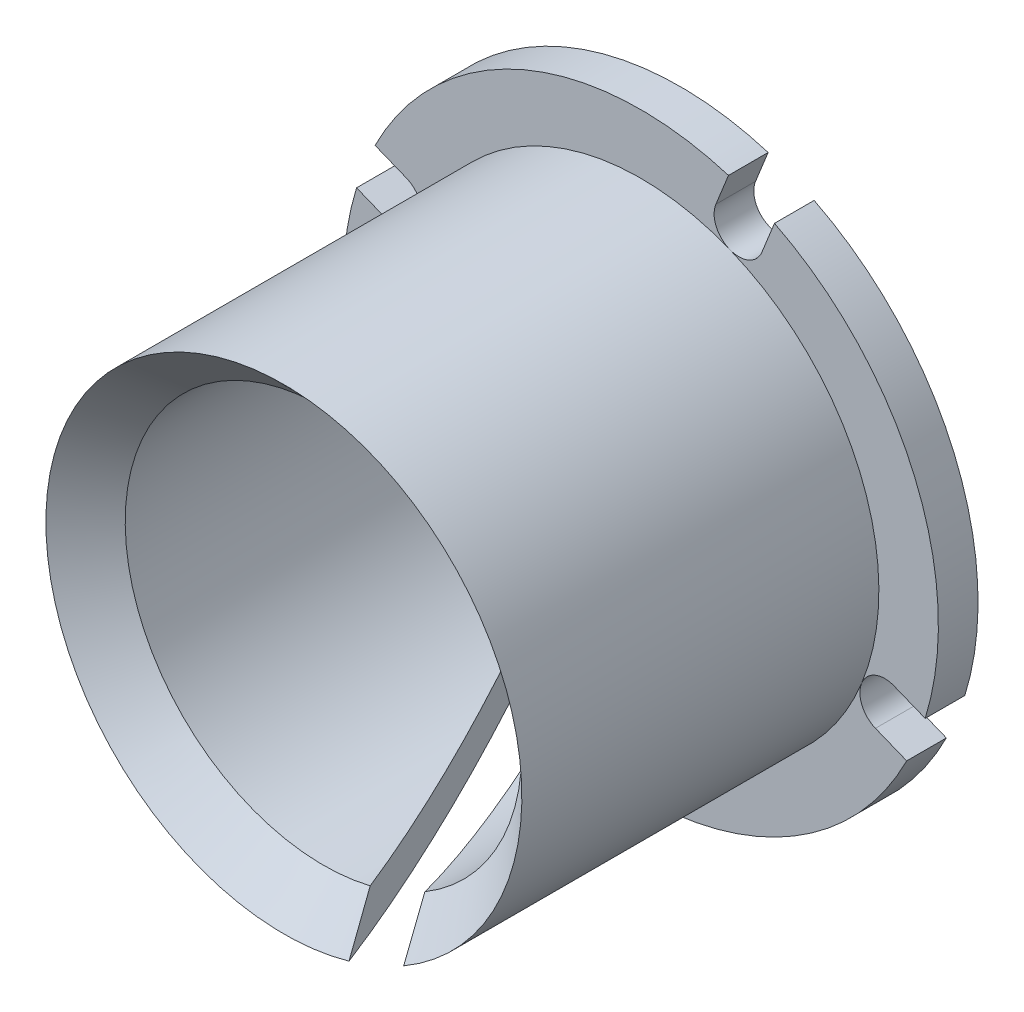
ISO-10303-21;
HEADER;
FILE_DESCRIPTION(('STEP AP214'),'2;1');
FILE_NAME('part.step','',(''),(''),'','','');
FILE_SCHEMA(('AUTOMOTIVE_DESIGN { 1 0 10303 214 1 1 1 1 }'));
ENDSEC;
DATA;
#1=APPLICATION_CONTEXT('core data for automotive mechanical design processes');
#2=APPLICATION_PROTOCOL_DEFINITION('international standard','automotive_design',2000,#1);
#3=PRODUCT_CONTEXT('',#1,'mechanical');
#4=PRODUCT('Part','Part','',(#3));
#5=PRODUCT_RELATED_PRODUCT_CATEGORY('part','',(#4));
#6=PRODUCT_DEFINITION_FORMATION('','',#4);
#7=PRODUCT_DEFINITION_CONTEXT('part definition',#1,'design');
#8=PRODUCT_DEFINITION('design','',#6,#7);
#9=PRODUCT_DEFINITION_SHAPE('','',#8);
#10=(LENGTH_UNIT() NAMED_UNIT(*) SI_UNIT(.MILLI.,.METRE.));
#11=(NAMED_UNIT(*) PLANE_ANGLE_UNIT() SI_UNIT($,.RADIAN.));
#12=(NAMED_UNIT(*) SI_UNIT($,.STERADIAN.) SOLID_ANGLE_UNIT());
#13=UNCERTAINTY_MEASURE_WITH_UNIT(LENGTH_MEASURE(1.E-05),#10,'distance_accuracy_value','');
#14=(GEOMETRIC_REPRESENTATION_CONTEXT(3) GLOBAL_UNCERTAINTY_ASSIGNED_CONTEXT((#13)) GLOBAL_UNIT_ASSIGNED_CONTEXT((#10,
#11,#12)) REPRESENTATION_CONTEXT('',''));
#15=CARTESIAN_POINT('',(0.,0.,0.));
#16=DIRECTION('',(0.,0.,1.));
#17=DIRECTION('',(1.,0.,0.));
#18=AXIS2_PLACEMENT_3D('',#15,#16,#17);
#19=CARTESIAN_POINT('',(0.,0.,0.4));
#20=DIRECTION('',(0.,0.,1.));
#21=DIRECTION('',(1.,0.,0.));
#22=AXIS2_PLACEMENT_3D('',#19,#20,#21);
#23=CYLINDRICAL_SURFACE('',#22,6.);
#24=DIRECTION('',(0.,0.,1.));
#25=VECTOR('',#24,1.);
#26=CARTESIAN_POINT('',(5.36099061428802,-2.69439782391461,0.));
#27=LINE('',#26,#25);
#28=CARTESIAN_POINT('',(5.36099061428802,-2.69439782391461,0.));
#29=VERTEX_POINT('',#28);
#30=CARTESIAN_POINT('',(5.36099061428802,-2.69439782391461,0.8));
#31=VERTEX_POINT('',#30);
#32=EDGE_CURVE('E223',#29,#31,#27,.T.);
#33=ORIENTED_EDGE('',*,*,#32,.T.);
#34=CARTESIAN_POINT('',(0.,0.,0.8));
#35=DIRECTION('',(0.,0.,1.));
#36=DIRECTION('',(1.,0.,0.));
#37=AXIS2_PLACEMENT_3D('',#34,#35,#36);
#38=CIRCLE('',#37,6.);
#39=CARTESIAN_POINT('',(-0.980328000398816,-5.9193713358459,0.8));
#40=VERTEX_POINT('',#39);
#41=EDGE_CURVE('E519',#40,#31,#38,.T.);
#42=ORIENTED_EDGE('',*,*,#41,.F.);
#43=DIRECTION('',(0.,0.,1.));
#44=VECTOR('',#43,1.);
#45=CARTESIAN_POINT('',(-0.980328000398816,-5.9193713358459,0.));
#46=LINE('',#45,#44);
#47=CARTESIAN_POINT('',(-0.980328000398816,-5.9193713358459,0.));
#48=VERTEX_POINT('',#47);
#49=EDGE_CURVE('E225',#40,#48,#46,.F.);
#50=ORIENTED_EDGE('',*,*,#49,.T.);
#51=CARTESIAN_POINT('',(0.,0.,0.));
#52=DIRECTION('',(0.,0.,1.));
#53=DIRECTION('',(1.,0.,0.));
#54=AXIS2_PLACEMENT_3D('',#51,#52,#53);
#55=CIRCLE('',#54,6.);
#56=EDGE_CURVE('E205',#29,#48,#55,.F.);
#57=ORIENTED_EDGE('',*,*,#56,.F.);
#58=EDGE_LOOP('',(#33,#42,#50,#57));
#59=FACE_BOUND('',#58,.T.);
#60=ADVANCED_FACE('F16',(#59),#23,.T.);
#61=CARTESIAN_POINT('',(5.38035372264551,-2.70218315796962,0.));
#62=DIRECTION('',(-0.373046126523998,-0.927812797651251,0.));
#63=DIRECTION('',(0.927812797651251,-0.373046126523998,0.));
#64=AXIS2_PLACEMENT_3D('',#61,#62,#63);
#65=PLANE('',#64);
#66=DIRECTION('',(0.927812797651253,-0.373046126523994,0.));
#67=VECTOR('',#66,1.);
#68=CARTESIAN_POINT('',(4.73088476428963,-2.44105086940282,0.));
#69=LINE('',#68,#67);
#70=CARTESIAN_POINT('',(4.73088151695123,-2.44104956372509,0.));
#71=VERTEX_POINT('',#70);
#72=EDGE_CURVE('E211',#71,#29,#69,.T.);
#73=ORIENTED_EDGE('',*,*,#72,.F.);
#74=DIRECTION('',(0.,0.,1.));
#75=VECTOR('',#74,1.);
#76=CARTESIAN_POINT('',(4.73088476428963,-2.44105086940282,0.));
#77=LINE('',#76,#75);
#78=CARTESIAN_POINT('',(4.73088151695123,-2.44104956372509,0.8));
#79=VERTEX_POINT('',#78);
#80=EDGE_CURVE('E222',#71,#79,#77,.T.);
#81=ORIENTED_EDGE('',*,*,#80,.T.);
#82=DIRECTION('',(-0.927812797651253,0.373046126523994,0.));
#83=VECTOR('',#82,1.);
#84=CARTESIAN_POINT('',(5.36099061428802,-2.69439782391461,0.8));
#85=LINE('',#84,#83);
#86=EDGE_CURVE('E465',#31,#79,#85,.T.);
#87=ORIENTED_EDGE('',*,*,#86,.F.);
#88=ORIENTED_EDGE('',*,*,#32,.F.);
#89=EDGE_LOOP('',(#73,#81,#87,#88));
#90=FACE_BOUND('',#89,.T.);
#91=ADVANCED_FACE('F343',(#90),#65,.F.);
#92=CARTESIAN_POINT('',(5.14433756729741,0.,0.));
#93=DIRECTION('',(0.,0.,-1.));
#94=DIRECTION('',(-1.,0.,0.));
#95=AXIS2_PLACEMENT_3D('',#92,#93,#94);
#96=PLANE('',#95);
#97=CARTESIAN_POINT('',(0.,0.,5.6843418860808E-11));
#98=DIRECTION('',(0.,0.,-1.));
#99=DIRECTION('',(-1.,0.,0.));
#100=AXIS2_PLACEMENT_3D('',#97,#98,#99);
#101=CIRCLE('',#100,4.28867513460318);
#102=CARTESIAN_POINT('',(-1.31354167313042,-4.08256569857309,4.62910450525257E-11));
#103=VERTEX_POINT('',#102);
#104=CARTESIAN_POINT('',(-2.41691959209265,-3.54277209196017,4.68421681819003E-11));
#105=VERTEX_POINT('',#104);
#106=EDGE_CURVE('E175',#103,#105,#101,.F.);
#107=ORIENTED_EDGE('',*,*,#106,.T.);
#108=DIRECTION('',(0.,1.,0.));
#109=VECTOR('',#108,1.);
#110=CARTESIAN_POINT('',(-2.41691959210124,0.,0.));
#111=LINE('',#110,#109);
#112=CARTESIAN_POINT('',(-2.41691959210124,-4.14710738772426,0.));
#113=VERTEX_POINT('',#112);
#114=EDGE_CURVE('E180',#105,#113,#111,.F.);
#115=ORIENTED_EDGE('',*,*,#114,.T.);
#116=CARTESIAN_POINT('',(0.,0.,0.));
#117=DIRECTION('',(0.,0.,1.));
#118=DIRECTION('',(1.,0.,0.));
#119=AXIS2_PLACEMENT_3D('',#116,#117,#118);
#120=CIRCLE('',#119,4.8);
#121=CARTESIAN_POINT('',(-2.71209066013154,-3.96037425645951,0.));
#122=VERTEX_POINT('',#121);
#123=EDGE_CURVE('E218',#113,#122,#120,.F.);
#124=ORIENTED_EDGE('',*,*,#123,.T.);
#125=DIRECTION('',(-0.565018887527407,-0.825077970095731,0.));
#126=VECTOR('',#125,1.);
#127=CARTESIAN_POINT('',(-2.71209066013154,-3.96037425645951,0.));
#128=LINE('',#127,#126);
#129=CARTESIAN_POINT('',(-3.39011332516443,-4.95046782057439,0.));
#130=VERTEX_POINT('',#129);
#131=EDGE_CURVE('E215',#122,#130,#128,.T.);
#132=ORIENTED_EDGE('',*,*,#131,.T.);
#133=CARTESIAN_POINT('',(0.,0.,0.));
#134=DIRECTION('',(0.,0.,1.));
#135=DIRECTION('',(1.,0.,0.));
#136=AXIS2_PLACEMENT_3D('',#133,#134,#135);
#137=CIRCLE('',#136,6.);
#138=CARTESIAN_POINT('',(-5.73403674078247,1.76658502635926,0.));
#139=VERTEX_POINT('',#138);
#140=EDGE_CURVE('E426',#139,#130,#137,.T.);
#141=ORIENTED_EDGE('',*,*,#140,.F.);
#142=DIRECTION('',(0.927812797651251,-0.373046126523999,0.));
#143=VECTOR('',#142,1.);
#144=CARTESIAN_POINT('',(-5.10393089077632,1.51323807184435,0.));
#145=LINE('',#144,#143);
#146=CARTESIAN_POINT('',(-5.10393089077632,1.51323807184435,0.));
#147=VERTEX_POINT('',#146);
#148=EDGE_CURVE('E427',#139,#147,#145,.T.);
#149=ORIENTED_EDGE('',*,*,#148,.T.);
#150=CARTESIAN_POINT('',(-4.91739854942327,1.97714074011577,0.));
#151=DIRECTION('',(0.,0.,-1.));
#152=DIRECTION('',(-1.,0.,0.));
#153=AXIS2_PLACEMENT_3D('',#150,#151,#152);
#154=CIRCLE('',#153,0.5);
#155=CARTESIAN_POINT('',(-4.73088151695123,2.44104956372509,0.));
#156=VERTEX_POINT('',#155);
#157=EDGE_CURVE('E217',#147,#156,#154,.F.);
#158=ORIENTED_EDGE('',*,*,#157,.T.);
#159=DIRECTION('',(-0.927812797651251,0.373046126523999,0.));
#160=VECTOR('',#159,1.);
#161=CARTESIAN_POINT('',(-5.38035372264551,2.70218315796962,0.));
#162=LINE('',#161,#160);
#163=CARTESIAN_POINT('',(-5.36099061428802,2.69439782391461,0.));
#164=VERTEX_POINT('',#163);
#165=EDGE_CURVE('E432',#156,#164,#162,.T.);
#166=ORIENTED_EDGE('',*,*,#165,.T.);
#167=CARTESIAN_POINT('',(0.,0.,0.));
#168=DIRECTION('',(0.,0.,1.));
#169=DIRECTION('',(1.,0.,0.));
#170=AXIS2_PLACEMENT_3D('',#167,#168,#169);
#171=CIRCLE('',#170,6.);
#172=CARTESIAN_POINT('',(1.76658502635926,5.73403674078247,0.));
#173=VERTEX_POINT('',#172);
#174=EDGE_CURVE('E435',#173,#164,#171,.T.);
#175=ORIENTED_EDGE('',*,*,#174,.F.);
#176=DIRECTION('',(-0.373046126523999,-0.927812797651251,0.));
#177=VECTOR('',#176,1.);
#178=CARTESIAN_POINT('',(1.51323807184435,5.10393089077632,0.));
#179=LINE('',#178,#177);
#180=CARTESIAN_POINT('',(1.51323807184435,5.10393089077632,0.));
#181=VERTEX_POINT('',#180);
#182=EDGE_CURVE('E442',#173,#181,#179,.T.);
#183=ORIENTED_EDGE('',*,*,#182,.T.);
#184=CARTESIAN_POINT('',(1.97714074011577,4.91739854942327,0.));
#185=DIRECTION('',(0.,0.,-1.));
#186=DIRECTION('',(-1.,0.,0.));
#187=AXIS2_PLACEMENT_3D('',#184,#185,#186);
#188=CIRCLE('',#187,0.5);
#189=CARTESIAN_POINT('',(2.44104956372509,4.73088151695123,0.));
#190=VERTEX_POINT('',#189);
#191=EDGE_CURVE('E214',#181,#190,#188,.F.);
#192=ORIENTED_EDGE('',*,*,#191,.T.);
#193=DIRECTION('',(0.373046126523999,0.927812797651251,0.));
#194=VECTOR('',#193,1.);
#195=CARTESIAN_POINT('',(2.70218315796962,5.38035372264551,0.));
#196=LINE('',#195,#194);
#197=CARTESIAN_POINT('',(2.69439782391461,5.36099061428802,0.));
#198=VERTEX_POINT('',#197);
#199=EDGE_CURVE('E445',#190,#198,#196,.T.);
#200=ORIENTED_EDGE('',*,*,#199,.T.);
#201=CARTESIAN_POINT('',(0.,0.,0.));
#202=DIRECTION('',(0.,0.,1.));
#203=DIRECTION('',(1.,0.,0.));
#204=AXIS2_PLACEMENT_3D('',#201,#202,#203);
#205=CIRCLE('',#204,6.);
#206=CARTESIAN_POINT('',(5.73403674078247,-1.76658502635926,0.));
#207=VERTEX_POINT('',#206);
#208=EDGE_CURVE('E448',#207,#198,#205,.T.);
#209=ORIENTED_EDGE('',*,*,#208,.F.);
#210=DIRECTION('',(-0.927812797651251,0.373046126523998,0.));
#211=VECTOR('',#210,1.);
#212=CARTESIAN_POINT('',(5.10393089077632,-1.51323807184435,0.));
#213=LINE('',#212,#211);
#214=CARTESIAN_POINT('',(5.10393089077632,-1.51323807184435,0.));
#215=VERTEX_POINT('',#214);
#216=EDGE_CURVE('E219',#207,#215,#213,.T.);
#217=ORIENTED_EDGE('',*,*,#216,.T.);
#218=CARTESIAN_POINT('',(4.91739854942327,-1.97714074011577,0.));
#219=DIRECTION('',(0.,0.,-1.));
#220=DIRECTION('',(-1.,0.,0.));
#221=AXIS2_PLACEMENT_3D('',#218,#219,#220);
#222=CIRCLE('',#221,0.5);
#223=EDGE_CURVE('E526',#215,#71,#222,.F.);
#224=ORIENTED_EDGE('',*,*,#223,.T.);
#225=ORIENTED_EDGE('',*,*,#72,.T.);
#226=ORIENTED_EDGE('',*,*,#56,.T.);
#227=DIRECTION('',(0.163388000066469,0.98656188930765,0.));
#228=VECTOR('',#227,1.);
#229=CARTESIAN_POINT('',(-0.784262400319053,-4.73549706867672,0.));
#230=LINE('',#229,#228);
#231=CARTESIAN_POINT('',(-0.784262400319053,-4.73549706867672,0.));
#232=VERTEX_POINT('',#231);
#233=EDGE_CURVE('E227',#48,#232,#230,.T.);
#234=ORIENTED_EDGE('',*,*,#233,.T.);
#235=CARTESIAN_POINT('',(0.,0.,0.));
#236=DIRECTION('',(0.,0.,1.));
#237=DIRECTION('',(1.,0.,0.));
#238=AXIS2_PLACEMENT_3D('',#235,#236,#237);
#239=CIRCLE('',#238,4.8);
#240=CARTESIAN_POINT('',(-1.31354167313875,-4.61677466126817,0.));
#241=VERTEX_POINT('',#240);
#242=EDGE_CURVE('E203',#232,#241,#239,.F.);
#243=ORIENTED_EDGE('',*,*,#242,.T.);
#244=DIRECTION('',(0.,1.,0.));
#245=VECTOR('',#244,1.);
#246=CARTESIAN_POINT('',(-1.31354167313875,-2.4,0.));
#247=LINE('',#246,#245);
#248=EDGE_CURVE('E182',#103,#241,#247,.F.);
#249=ORIENTED_EDGE('',*,*,#248,.F.);
#250=EDGE_LOOP('',(#107,#115,#124,#132,#141,#149,#158,#166,#175,#183,#192,#200,#209,#217,#224,
#225,#226,#234,#243,#249));
#251=FACE_BOUND('',#250,.T.);
#252=ADVANCED_FACE('F177',(#251),#96,.T.);
#253=CARTESIAN_POINT('',(0.,0.,5.6843418860808E-11));
#254=DIRECTION('',(0.,0.,-1.));
#255=DIRECTION('',(-1.,0.,0.));
#256=AXIS2_PLACEMENT_3D('',#253,#254,#255);
#257=CONICAL_SURFACE('',#256,4.28867513460318,0.523598775592442);
#258=CARTESIAN_POINT('',(0.,0.,0.5));
#259=DIRECTION('',(0.,0.,1.));
#260=DIRECTION('',(1.,0.,0.));
#261=AXIS2_PLACEMENT_3D('',#258,#259,#260);
#262=CIRCLE('',#261,4.);
#263=CARTESIAN_POINT('',(-1.08038784405548,-3.85133251051378,0.500000000012368));
#264=VERTEX_POINT('',#263);
#265=CARTESIAN_POINT('',(-2.18376576301788,-3.35129334621624,0.500000000012568));
#266=VERTEX_POINT('',#265);
#267=EDGE_CURVE('E192',#264,#266,#262,.T.);
#268=ORIENTED_EDGE('',*,*,#267,.T.);
#269=CARTESIAN_POINT('',(-2.41691959208126,-3.54277209197158,3.49858519814594E-11));
#270=CARTESIAN_POINT('',(-2.37803628020154,-3.51102491668834,0.0833855314573152));
#271=CARTESIAN_POINT('',(-2.33916513905664,-3.47919476735721,0.166744962653267));
#272=CARTESIAN_POINT('',(-2.26144719603219,-3.41536851878887,0.333411629319606));
#273=CARTESIAN_POINT('',(-2.222600394154,-3.38337241954224,0.416718864787033));
#274=CARTESIAN_POINT('',(-2.18376576301203,-3.35129334623831,0.50000000002512));
#275=B_SPLINE_CURVE_WITH_KNOTS('',3,(#269,#270,#271,#272,#273,#274),.UNSPECIFIED.,.F.,.F.,(4,2,
4),(0.,0.291986761869346,0.583973540302023),.UNSPECIFIED.);
#276=EDGE_CURVE('E190',#105,#266,#275,.T.);
#277=ORIENTED_EDGE('',*,*,#276,.F.);
#278=ORIENTED_EDGE('',*,*,#106,.F.);
#279=CARTESIAN_POINT('',(-1.08038784404142,-3.85133251052534,0.500000000018029));
#280=CARTESIAN_POINT('',(-1.11916929733107,-3.89030904864537,0.416832905063214));
#281=CARTESIAN_POINT('',(-1.15798951357386,-3.9290667538023,0.33358268268302));
#282=CARTESIAN_POINT('',(-1.23570745663134,-4.00614448298187,0.166916015956655));
#283=CARTESIAN_POINT('',(-1.27460518341543,-4.04446450717721,0.0834995716760906));
#284=CARTESIAN_POINT('',(-1.31354167312208,-4.08256569858217,3.57541953012447E-11));
#285=B_SPLINE_CURVE_WITH_KNOTS('',3,(#279,#280,#281,#282,#283,#284),.UNSPECIFIED.,.F.,.F.,(4,2,
4),(0.,0.299095161814244,0.598190205600369),.UNSPECIFIED.);
#286=EDGE_CURVE('E196',#264,#103,#285,.T.);
#287=ORIENTED_EDGE('',*,*,#286,.F.);
#288=EDGE_LOOP('',(#268,#277,#278,#287));
#289=FACE_BOUND('',#288,.T.);
#290=ADVANCED_FACE('F191',(#289),#257,.F.);
#291=CARTESIAN_POINT('',(1.63077474543137,-2.4,6.31410693579353));
#292=DIRECTION('',(-0.90630778703665,0.,0.4226182617407));
#293=DIRECTION('',(0.4226182617407,0.,0.90630778703665));
#294=AXIS2_PLACEMENT_3D('',#291,#292,#293);
#295=PLANE('',#294);
#296=ORIENTED_EDGE('',*,*,#286,.T.);
#297=ORIENTED_EDGE('',*,*,#248,.T.);
#298=CARTESIAN_POINT('',(0.,0.,2.81689920842375));
#299=DIRECTION('',(-0.90630778703665,0.,0.4226182617407));
#300=DIRECTION('',(0.4226182617407,0.,0.90630778703665));
#301=AXIS2_PLACEMENT_3D('',#298,#299,#300);
#302=ELLIPSE('',#301,11.357767599132,4.8);
#303=CARTESIAN_POINT('',(2.41691959210714,-4.14710738770688,8.00000000001264));
#304=VERTEX_POINT('',#303);
#305=EDGE_CURVE('E229',#304,#241,#302,.F.);
#306=ORIENTED_EDGE('',*,*,#305,.F.);
#307=CARTESIAN_POINT('',(2.41691959212222,-4.14710738769394,8.00000000001707));
#308=CARTESIAN_POINT('',(2.35473874483053,-4.02900830269591,7.86665274269086));
#309=CARTESIAN_POINT('',(2.29256114398589,-3.91089965003299,7.73331244738814));
#310=CARTESIAN_POINT('',(2.16821243514287,-3.67466320928658,7.46664578072716));
#311=CARTESIAN_POINT('',(2.1060413271445,-3.55653542120307,7.33331940936891));
#312=CARTESIAN_POINT('',(2.04387346559318,-3.43839806545466,7.20000000003417));
#313=B_SPLINE_CURVE_WITH_KNOTS('',3,(#307,#308,#309,#310,#311,#312),.UNSPECIFIED.,.F.,.F.,(4,2,
4),(0.,0.566001837531067,1.13200367549739),.UNSPECIFIED.);
#314=CARTESIAN_POINT('',(2.04387346559673,-3.43839806547742,7.20000000004179));
#315=VERTEX_POINT('',#314);
#316=EDGE_CURVE('E186',#304,#315,#313,.T.);
#317=ORIENTED_EDGE('',*,*,#316,.T.);
#318=CARTESIAN_POINT('',(0.,0.,2.81689920842375));
#319=DIRECTION('',(-0.90630778703665,0.,0.4226182617407));
#320=DIRECTION('',(0.4226182617407,0.,0.90630778703665));
#321=AXIS2_PLACEMENT_3D('',#318,#319,#320);
#322=ELLIPSE('',#321,9.46480633260998,4.);
#323=EDGE_CURVE('E500',#315,#264,#322,.F.);
#324=ORIENTED_EDGE('',*,*,#323,.T.);
#325=EDGE_LOOP('',(#296,#297,#306,#317,#324));
#326=FACE_BOUND('',#325,.T.);
#327=ADVANCED_FACE('F338',(#326),#295,.T.);
#328=CARTESIAN_POINT('',(-0.784262400319053,-4.73549706867672,0.));
#329=DIRECTION('',(0.98656188930765,-0.163388000066469,0.));
#330=DIRECTION('',(0.163388000066469,0.98656188930765,0.));
#331=AXIS2_PLACEMENT_3D('',#328,#329,#330);
#332=PLANE('',#331);
#333=DIRECTION('',(0.,0.,1.));
#334=VECTOR('',#333,1.);
#335=CARTESIAN_POINT('',(-0.784262400319054,-4.73549706867672,4.4));
#336=LINE('',#335,#334);
#337=CARTESIAN_POINT('',(-0.784262400319053,-4.73549706867672,0.8));
#338=VERTEX_POINT('',#337);
#339=EDGE_CURVE('E299',#232,#338,#336,.T.);
#340=ORIENTED_EDGE('',*,*,#339,.F.);
#341=ORIENTED_EDGE('',*,*,#233,.F.);
#342=ORIENTED_EDGE('',*,*,#49,.F.);
#343=DIRECTION('',(-0.163388000066469,-0.98656188930765,0.));
#344=VECTOR('',#343,1.);
#345=CARTESIAN_POINT('',(-0.784262400319053,-4.73549706867672,0.8));
#346=LINE('',#345,#344);
#347=EDGE_CURVE('E495',#338,#40,#346,.T.);
#348=ORIENTED_EDGE('',*,*,#347,.F.);
#349=EDGE_LOOP('',(#340,#341,#342,#348));
#350=FACE_BOUND('',#349,.T.);
#351=ADVANCED_FACE('F481',(#350),#332,.F.);
#352=CARTESIAN_POINT('',(5.4,0.,0.8));
#353=DIRECTION('',(0.,0.,1.));
#354=DIRECTION('',(1.,0.,0.));
#355=AXIS2_PLACEMENT_3D('',#352,#353,#354);
#356=PLANE('',#355);
#357=CARTESIAN_POINT('',(4.91739854942327,-1.97714074011577,0.8));
#358=DIRECTION('',(0.,0.,-1.));
#359=DIRECTION('',(-1.,0.,0.));
#360=AXIS2_PLACEMENT_3D('',#357,#358,#359);
#361=CIRCLE('',#360,0.5);
#362=CARTESIAN_POINT('',(4.4523779058576,-1.79341322160597,0.8));
#363=VERTEX_POINT('',#362);
#364=EDGE_CURVE('E524',#79,#363,#361,.T.);
#365=ORIENTED_EDGE('',*,*,#364,.T.);
#366=CARTESIAN_POINT('',(0.,0.,0.8));
#367=DIRECTION('',(0.,0.,1.));
#368=DIRECTION('',(1.,0.,0.));
#369=AXIS2_PLACEMENT_3D('',#366,#367,#368);
#370=CIRCLE('',#369,4.8);
#371=EDGE_CURVE('E296',#338,#363,#370,.T.);
#372=ORIENTED_EDGE('',*,*,#371,.F.);
#373=ORIENTED_EDGE('',*,*,#347,.T.);
#374=ORIENTED_EDGE('',*,*,#41,.T.);
#375=ORIENTED_EDGE('',*,*,#86,.T.);
#376=EDGE_LOOP('',(#365,#372,#373,#374,#375));
#377=FACE_BOUND('',#376,.T.);
#378=ADVANCED_FACE('F478',(#377),#356,.T.);
#379=CARTESIAN_POINT('',(4.91739854942327,-1.97714074011577,0.));
#380=DIRECTION('',(0.,0.,-1.));
#381=DIRECTION('',(-1.,0.,0.));
#382=AXIS2_PLACEMENT_3D('',#379,#380,#381);
#383=CYLINDRICAL_SURFACE('',#382,0.5);
#384=ORIENTED_EDGE('',*,*,#223,.F.);
#385=DIRECTION('',(0.,0.,1.));
#386=VECTOR('',#385,1.);
#387=CARTESIAN_POINT('',(5.10393089077632,-1.51323807184435,0.));
#388=LINE('',#387,#386);
#389=CARTESIAN_POINT('',(5.10393089077632,-1.51323807184435,0.8));
#390=VERTEX_POINT('',#389);
#391=EDGE_CURVE('E221',#215,#390,#388,.T.);
#392=ORIENTED_EDGE('',*,*,#391,.T.);
#393=CARTESIAN_POINT('',(4.91739854942327,-1.97714074011577,0.8));
#394=DIRECTION('',(0.,0.,-1.));
#395=DIRECTION('',(-1.,0.,0.));
#396=AXIS2_PLACEMENT_3D('',#393,#394,#395);
#397=CIRCLE('',#396,0.5);
#398=CARTESIAN_POINT('',(4.45462320101836,-1.78782888916948,0.8));
#399=VERTEX_POINT('',#398);
#400=EDGE_CURVE('E290',#399,#390,#397,.T.);
#401=ORIENTED_EDGE('',*,*,#400,.F.);
#402=CARTESIAN_POINT('',(0.,0.,0.8));
#403=DIRECTION('',(0.,0.,1.));
#404=DIRECTION('',(0.927578730387,-0.373627754501244,0.));
#405=AXIS2_PLACEMENT_3D('',#402,#403,#404);
#406=CIRCLE('',#405,4.8);
#407=EDGE_CURVE('E293',#363,#399,#406,.T.);
#408=ORIENTED_EDGE('',*,*,#407,.F.);
#409=ORIENTED_EDGE('',*,*,#364,.F.);
#410=ORIENTED_EDGE('',*,*,#80,.F.);
#411=EDGE_LOOP('',(#384,#392,#401,#408,#409,#410));
#412=FACE_BOUND('',#411,.T.);
#413=ADVANCED_FACE('F467',(#412),#383,.F.);
#414=CARTESIAN_POINT('',(5.10393089077632,-1.51323807184435,0.));
#415=DIRECTION('',(0.373046126523998,0.927812797651251,0.));
#416=DIRECTION('',(-0.927812797651251,0.373046126523998,0.));
#417=AXIS2_PLACEMENT_3D('',#414,#415,#416);
#418=PLANE('',#417);
#419=DIRECTION('',(0.927812797651252,-0.373046126523994,0.));
#420=VECTOR('',#419,1.);
#421=CARTESIAN_POINT('',(5.10393089077632,-1.51323807184435,0.8));
#422=LINE('',#421,#420);
#423=CARTESIAN_POINT('',(5.73403674078247,-1.76658502635926,0.8));
#424=VERTEX_POINT('',#423);
#425=EDGE_CURVE('E289',#390,#424,#422,.T.);
#426=ORIENTED_EDGE('',*,*,#425,.F.);
#427=ORIENTED_EDGE('',*,*,#391,.F.);
#428=ORIENTED_EDGE('',*,*,#216,.F.);
#429=DIRECTION('',(0.,0.,1.));
#430=VECTOR('',#429,1.);
#431=CARTESIAN_POINT('',(5.73403674078247,-1.76658502635926,0.4));
#432=LINE('',#431,#430);
#433=EDGE_CURVE('E452',#424,#207,#432,.F.);
#434=ORIENTED_EDGE('',*,*,#433,.F.);
#435=EDGE_LOOP('',(#426,#427,#428,#434));
#436=FACE_BOUND('',#435,.T.);
#437=ADVANCED_FACE('F477',(#436),#418,.F.);
#438=CARTESIAN_POINT('',(0.,0.,0.4));
#439=DIRECTION('',(0.,0.,1.));
#440=DIRECTION('',(1.,0.,0.));
#441=AXIS2_PLACEMENT_3D('',#438,#439,#440);
#442=CYLINDRICAL_SURFACE('',#441,6.);
#443=DIRECTION('',(0.,0.,1.));
#444=VECTOR('',#443,1.);
#445=CARTESIAN_POINT('',(2.69439782391461,5.36099061428802,0.));
#446=LINE('',#445,#444);
#447=CARTESIAN_POINT('',(2.69439782391461,5.36099061428802,0.8));
#448=VERTEX_POINT('',#447);
#449=EDGE_CURVE('E447',#198,#448,#446,.T.);
#450=ORIENTED_EDGE('',*,*,#449,.T.);
#451=CARTESIAN_POINT('',(0.,0.,0.8));
#452=DIRECTION('',(0.,0.,1.));
#453=DIRECTION('',(1.,0.,0.));
#454=AXIS2_PLACEMENT_3D('',#451,#452,#453);
#455=CIRCLE('',#454,6.);
#456=EDGE_CURVE('E286',#424,#448,#455,.T.);
#457=ORIENTED_EDGE('',*,*,#456,.F.);
#458=ORIENTED_EDGE('',*,*,#433,.T.);
#459=ORIENTED_EDGE('',*,*,#208,.T.);
#460=EDGE_LOOP('',(#450,#457,#458,#459));
#461=FACE_BOUND('',#460,.T.);
#462=ADVANCED_FACE('F573',(#461),#442,.T.);
#463=CARTESIAN_POINT('',(2.70218315796962,5.38035372264551,0.));
#464=DIRECTION('',(0.927812797651251,-0.373046126523999,0.));
#465=DIRECTION('',(0.373046126523999,0.927812797651251,0.));
#466=AXIS2_PLACEMENT_3D('',#463,#464,#465);
#467=PLANE('',#466);
#468=ORIENTED_EDGE('',*,*,#199,.F.);
#469=DIRECTION('',(0.,0.,1.));
#470=VECTOR('',#469,1.);
#471=CARTESIAN_POINT('',(2.44105086940282,4.73088476428963,0.));
#472=LINE('',#471,#470);
#473=CARTESIAN_POINT('',(2.44104956372509,4.73088151695123,0.8));
#474=VERTEX_POINT('',#473);
#475=EDGE_CURVE('E275',#190,#474,#472,.T.);
#476=ORIENTED_EDGE('',*,*,#475,.T.);
#477=DIRECTION('',(-0.373046126523994,-0.927812797651253,0.));
#478=VECTOR('',#477,1.);
#479=CARTESIAN_POINT('',(2.69439782391461,5.36099061428802,0.8));
#480=LINE('',#479,#478);
#481=EDGE_CURVE('E283',#448,#474,#480,.T.);
#482=ORIENTED_EDGE('',*,*,#481,.F.);
#483=ORIENTED_EDGE('',*,*,#449,.F.);
#484=EDGE_LOOP('',(#468,#476,#482,#483));
#485=FACE_BOUND('',#484,.T.);
#486=ADVANCED_FACE('F569',(#485),#467,.F.);
#487=CARTESIAN_POINT('',(1.51323807184435,5.10393089077632,0.));
#488=DIRECTION('',(-0.927812797651251,0.373046126523999,0.));
#489=DIRECTION('',(-0.373046126523999,-0.927812797651251,0.));
#490=AXIS2_PLACEMENT_3D('',#487,#488,#489);
#491=PLANE('',#490);
#492=DIRECTION('',(0.373046126523995,0.927812797651252,0.));
#493=VECTOR('',#492,1.);
#494=CARTESIAN_POINT('',(1.51323807184435,5.10393089077632,0.8));
#495=LINE('',#494,#493);
#496=CARTESIAN_POINT('',(1.51323807184435,5.10393089077632,0.8));
#497=VERTEX_POINT('',#496);
#498=CARTESIAN_POINT('',(1.76658502635926,5.73403674078247,0.8));
#499=VERTEX_POINT('',#498);
#500=EDGE_CURVE('E271',#497,#499,#495,.T.);
#501=ORIENTED_EDGE('',*,*,#500,.F.);
#502=DIRECTION('',(0.,0.,-1.));
#503=VECTOR('',#502,1.);
#504=CARTESIAN_POINT('',(1.51323807184434,5.10393089077632,0.));
#505=LINE('',#504,#503);
#506=EDGE_CURVE('E280',#497,#181,#505,.T.);
#507=ORIENTED_EDGE('',*,*,#506,.T.);
#508=ORIENTED_EDGE('',*,*,#182,.F.);
#509=DIRECTION('',(0.,0.,1.));
#510=VECTOR('',#509,1.);
#511=CARTESIAN_POINT('',(1.76658502635926,5.73403674078247,0.4));
#512=LINE('',#511,#510);
#513=EDGE_CURVE('E439',#499,#173,#512,.F.);
#514=ORIENTED_EDGE('',*,*,#513,.F.);
#515=EDGE_LOOP('',(#501,#507,#508,#514));
#516=FACE_BOUND('',#515,.T.);
#517=ADVANCED_FACE('F564',(#516),#491,.F.);
#518=CARTESIAN_POINT('',(0.,0.,0.4));
#519=DIRECTION('',(0.,0.,1.));
#520=DIRECTION('',(1.,0.,0.));
#521=AXIS2_PLACEMENT_3D('',#518,#519,#520);
#522=CYLINDRICAL_SURFACE('',#521,6.);
#523=ORIENTED_EDGE('',*,*,#513,.T.);
#524=ORIENTED_EDGE('',*,*,#174,.T.);
#525=DIRECTION('',(0.,0.,1.));
#526=VECTOR('',#525,1.);
#527=CARTESIAN_POINT('',(-5.36099061428802,2.69439782391461,0.));
#528=LINE('',#527,#526);
#529=CARTESIAN_POINT('',(-5.36099061428802,2.69439782391461,0.8));
#530=VERTEX_POINT('',#529);
#531=EDGE_CURVE('E434',#164,#530,#528,.T.);
#532=ORIENTED_EDGE('',*,*,#531,.T.);
#533=CARTESIAN_POINT('',(0.,0.,0.8));
#534=DIRECTION('',(0.,0.,1.));
#535=DIRECTION('',(1.,0.,0.));
#536=AXIS2_PLACEMENT_3D('',#533,#534,#535);
#537=CIRCLE('',#536,6.);
#538=EDGE_CURVE('E268',#499,#530,#537,.T.);
#539=ORIENTED_EDGE('',*,*,#538,.F.);
#540=EDGE_LOOP('',(#523,#524,#532,#539));
#541=FACE_BOUND('',#540,.T.);
#542=ADVANCED_FACE('F561',(#541),#522,.T.);
#543=CARTESIAN_POINT('',(-5.38035372264551,2.70218315796962,0.));
#544=DIRECTION('',(0.373046126523999,0.927812797651251,0.));
#545=DIRECTION('',(-0.927812797651251,0.373046126523999,0.));
#546=AXIS2_PLACEMENT_3D('',#543,#544,#545);
#547=PLANE('',#546);
#548=ORIENTED_EDGE('',*,*,#165,.F.);
#549=DIRECTION('',(0.,0.,1.));
#550=VECTOR('',#549,1.);
#551=CARTESIAN_POINT('',(-4.73088476428963,2.44105086940282,0.));
#552=LINE('',#551,#550);
#553=CARTESIAN_POINT('',(-4.73088151695123,2.44104956372509,0.8));
#554=VERTEX_POINT('',#553);
#555=EDGE_CURVE('E259',#156,#554,#552,.T.);
#556=ORIENTED_EDGE('',*,*,#555,.T.);
#557=DIRECTION('',(0.927812797651253,-0.373046126523994,0.));
#558=VECTOR('',#557,1.);
#559=CARTESIAN_POINT('',(-5.36099061428802,2.69439782391461,0.8));
#560=LINE('',#559,#558);
#561=EDGE_CURVE('E265',#530,#554,#560,.T.);
#562=ORIENTED_EDGE('',*,*,#561,.F.);
#563=ORIENTED_EDGE('',*,*,#531,.F.);
#564=EDGE_LOOP('',(#548,#556,#562,#563));
#565=FACE_BOUND('',#564,.T.);
#566=ADVANCED_FACE('F553',(#565),#547,.F.);
#567=CARTESIAN_POINT('',(-5.10393089077632,1.51323807184435,0.));
#568=DIRECTION('',(-0.373046126523999,-0.927812797651251,0.));
#569=DIRECTION('',(0.927812797651251,-0.373046126523999,0.));
#570=AXIS2_PLACEMENT_3D('',#567,#568,#569);
#571=PLANE('',#570);
#572=DIRECTION('',(-0.927812797651252,0.373046126523994,0.));
#573=VECTOR('',#572,1.);
#574=CARTESIAN_POINT('',(-5.10393089077632,1.51323807184435,0.8));
#575=LINE('',#574,#573);
#576=CARTESIAN_POINT('',(-5.10393089077632,1.51323807184435,0.8));
#577=VERTEX_POINT('',#576);
#578=CARTESIAN_POINT('',(-5.73403674078247,1.76658502635926,0.8));
#579=VERTEX_POINT('',#578);
#580=EDGE_CURVE('E254',#577,#579,#575,.T.);
#581=ORIENTED_EDGE('',*,*,#580,.F.);
#582=DIRECTION('',(0.,0.,-1.));
#583=VECTOR('',#582,1.);
#584=CARTESIAN_POINT('',(-5.10393089077632,1.51323807184434,0.));
#585=LINE('',#584,#583);
#586=EDGE_CURVE('E262',#577,#147,#585,.T.);
#587=ORIENTED_EDGE('',*,*,#586,.T.);
#588=ORIENTED_EDGE('',*,*,#148,.F.);
#589=DIRECTION('',(0.,0.,1.));
#590=VECTOR('',#589,1.);
#591=CARTESIAN_POINT('',(-5.73403674078247,1.76658502635926,0.4));
#592=LINE('',#591,#590);
#593=EDGE_CURVE('E423',#579,#139,#592,.F.);
#594=ORIENTED_EDGE('',*,*,#593,.F.);
#595=EDGE_LOOP('',(#581,#587,#588,#594));
#596=FACE_BOUND('',#595,.T.);
#597=ADVANCED_FACE('F547',(#596),#571,.F.);
#598=CARTESIAN_POINT('',(0.,0.,0.4));
#599=DIRECTION('',(0.,0.,1.));
#600=DIRECTION('',(1.,0.,0.));
#601=AXIS2_PLACEMENT_3D('',#598,#599,#600);
#602=CYLINDRICAL_SURFACE('',#601,6.);
#603=DIRECTION('',(0.,0.,1.));
#604=VECTOR('',#603,1.);
#605=CARTESIAN_POINT('',(-3.39011332516443,-4.95046782057439,0.));
#606=LINE('',#605,#604);
#607=CARTESIAN_POINT('',(-3.39011332516443,-4.95046782057439,0.8));
#608=VERTEX_POINT('',#607);
#609=EDGE_CURVE('E430',#130,#608,#606,.T.);
#610=ORIENTED_EDGE('',*,*,#609,.T.);
#611=CARTESIAN_POINT('',(0.,0.,0.8));
#612=DIRECTION('',(0.,0.,1.));
#613=DIRECTION('',(1.,0.,0.));
#614=AXIS2_PLACEMENT_3D('',#611,#612,#613);
#615=CIRCLE('',#614,6.);
#616=EDGE_CURVE('E251',#579,#608,#615,.T.);
#617=ORIENTED_EDGE('',*,*,#616,.F.);
#618=ORIENTED_EDGE('',*,*,#593,.T.);
#619=ORIENTED_EDGE('',*,*,#140,.T.);
#620=EDGE_LOOP('',(#610,#617,#618,#619));
#621=FACE_BOUND('',#620,.T.);
#622=ADVANCED_FACE('F537',(#621),#602,.T.);
#623=CARTESIAN_POINT('',(-3.39011332516443,-4.95046782057439,0.));
#624=DIRECTION('',(-0.825077970095732,0.565018887527405,0.));
#625=DIRECTION('',(-0.565018887527405,-0.825077970095732,0.));
#626=AXIS2_PLACEMENT_3D('',#623,#624,#625);
#627=PLANE('',#626);
#628=ORIENTED_EDGE('',*,*,#609,.F.);
#629=ORIENTED_EDGE('',*,*,#131,.F.);
#630=DIRECTION('',(0.,0.,1.));
#631=VECTOR('',#630,1.);
#632=CARTESIAN_POINT('',(-2.71209066013154,-3.96037425645951,4.4));
#633=LINE('',#632,#631);
#634=CARTESIAN_POINT('',(-2.71209066013154,-3.96037425645951,0.8));
#635=VERTEX_POINT('',#634);
#636=EDGE_CURVE('E250',#635,#122,#633,.F.);
#637=ORIENTED_EDGE('',*,*,#636,.F.);
#638=DIRECTION('',(0.565018887527407,0.825077970095731,0.));
#639=VECTOR('',#638,1.);
#640=CARTESIAN_POINT('',(-3.39011332516443,-4.95046782057439,0.8));
#641=LINE('',#640,#639);
#642=EDGE_CURVE('E256',#608,#635,#641,.T.);
#643=ORIENTED_EDGE('',*,*,#642,.F.);
#644=EDGE_LOOP('',(#628,#629,#637,#643));
#645=FACE_BOUND('',#644,.T.);
#646=ADVANCED_FACE('F320',(#645),#627,.F.);
#647=CARTESIAN_POINT('',(0.724466958394717,-2.4,6.73672519753423));
#648=DIRECTION('',(0.90630778703665,0.,-0.4226182617407));
#649=DIRECTION('',(-0.4226182617407,0.,-0.90630778703665));
#650=AXIS2_PLACEMENT_3D('',#647,#648,#649);
#651=PLANE('',#650);
#652=CARTESIAN_POINT('',(0.,0.,5.18310079157625));
#653=DIRECTION('',(0.90630778703665,0.,-0.4226182617407));
#654=DIRECTION('',(0.4226182617407,0.,0.90630778703665));
#655=AXIS2_PLACEMENT_3D('',#652,#653,#654);
#656=ELLIPSE('',#655,9.46480633260998,4.);
#657=CARTESIAN_POINT('',(0.940495546634318,-3.88786163936544,7.20000000005374));
#658=VERTEX_POINT('',#657);
#659=EDGE_CURVE('E310',#266,#658,#656,.F.);
#660=ORIENTED_EDGE('',*,*,#659,.T.);
#661=CARTESIAN_POINT('',(0.940495546639533,-3.88786163935363,7.20000000004575));
#662=CARTESIAN_POINT('',(0.971515304603803,-3.94879738254612,7.26652208567697));
#663=CARTESIAN_POINT('',(1.0025546639261,-4.00967719746505,7.33308620655397));
#664=CARTESIAN_POINT('',(1.06466843152165,-4.13133642476271,7.4662896110234));
#665=CARTESIAN_POINT('',(1.09574283974361,-4.19211583728802,7.53292889450584));
#666=CARTESIAN_POINT('',(1.18901255769734,-4.37432094739686,7.73294645012972));
#667=CARTESIAN_POINT('',(1.25125434626656,-4.49561348914504,7.86642439645886));
#668=CARTESIAN_POINT('',(1.31354167315187,-4.61677466124235,8.00000000002814));
#669=B_SPLINE_CURVE_WITH_KNOTS('',3,(#661,#662,#663,#664,#665,#666,#667,#668),.UNSPECIFIED.,.F.,
.F.,(4,2,2,4),(0.,0.286190756701223,0.572381095172635,1.14476190540016),.UNSPECIFIED.);
#670=CARTESIAN_POINT('',(1.31354167314531,-4.61677466125525,8.00000000001406));
#671=VERTEX_POINT('',#670);
#672=EDGE_CURVE('E230',#658,#671,#669,.T.);
#673=ORIENTED_EDGE('',*,*,#672,.T.);
#674=CARTESIAN_POINT('',(0.,0.,5.18310079157625));
#675=DIRECTION('',(0.90630778703665,0.,-0.4226182617407));
#676=DIRECTION('',(0.4226182617407,0.,0.90630778703665));
#677=AXIS2_PLACEMENT_3D('',#674,#675,#676);
#678=ELLIPSE('',#677,11.357767599132,4.8);
#679=EDGE_CURVE('E202',#113,#671,#678,.F.);
#680=ORIENTED_EDGE('',*,*,#679,.F.);
#681=ORIENTED_EDGE('',*,*,#114,.F.);
#682=ORIENTED_EDGE('',*,*,#276,.T.);
#683=EDGE_LOOP('',(#660,#673,#680,#681,#682));
#684=FACE_BOUND('',#683,.T.);
#685=ADVANCED_FACE('F199',(#684),#651,.T.);
#686=CARTESIAN_POINT('',(0.,0.,3.85));
#687=DIRECTION('',(0.,0.,1.));
#688=DIRECTION('',(1.,0.,0.));
#689=AXIS2_PLACEMENT_3D('',#686,#687,#688);
#690=CYLINDRICAL_SURFACE('',#689,4.);
#691=CARTESIAN_POINT('',(0.,0.,7.20000000006848));
#692=DIRECTION('',(0.,0.,1.));
#693=DIRECTION('',(1.,0.,0.));
#694=AXIS2_PLACEMENT_3D('',#691,#692,#693);
#695=CIRCLE('',#694,4.0000000000191);
#696=EDGE_CURVE('E246',#315,#658,#695,.T.);
#697=ORIENTED_EDGE('',*,*,#696,.T.);
#698=ORIENTED_EDGE('',*,*,#659,.F.);
#699=ORIENTED_EDGE('',*,*,#267,.F.);
#700=ORIENTED_EDGE('',*,*,#323,.F.);
#701=EDGE_LOOP('',(#697,#698,#699,#700));
#702=FACE_BOUND('',#701,.T.);
#703=ADVANCED_FACE('F319',(#702),#690,.F.);
#704=CARTESIAN_POINT('',(5.4,0.,0.8));
#705=DIRECTION('',(0.,0.,1.));
#706=DIRECTION('',(1.,0.,0.));
#707=AXIS2_PLACEMENT_3D('',#704,#705,#706);
#708=PLANE('',#707);
#709=ORIENTED_EDGE('',*,*,#456,.T.);
#710=ORIENTED_EDGE('',*,*,#481,.T.);
#711=CARTESIAN_POINT('',(1.97714074011577,4.91739854942327,0.8));
#712=DIRECTION('',(0.,0.,-1.));
#713=DIRECTION('',(-1.,0.,0.));
#714=AXIS2_PLACEMENT_3D('',#711,#712,#713);
#715=CIRCLE('',#714,0.5);
#716=CARTESIAN_POINT('',(1.79341322160492,4.45237790585802,0.8));
#717=VERTEX_POINT('',#716);
#718=EDGE_CURVE('E281',#474,#717,#715,.T.);
#719=ORIENTED_EDGE('',*,*,#718,.T.);
#720=CARTESIAN_POINT('',(0.,0.,0.8));
#721=DIRECTION('',(0.,0.,1.));
#722=DIRECTION('',(1.,0.,0.));
#723=AXIS2_PLACEMENT_3D('',#720,#721,#722);
#724=CIRCLE('',#723,4.8);
#725=EDGE_CURVE('E243',#399,#717,#724,.T.);
#726=ORIENTED_EDGE('',*,*,#725,.F.);
#727=ORIENTED_EDGE('',*,*,#400,.T.);
#728=ORIENTED_EDGE('',*,*,#425,.T.);
#729=EDGE_LOOP('',(#709,#710,#719,#726,#727,#728));
#730=FACE_BOUND('',#729,.T.);
#731=ADVANCED_FACE('F404',(#730),#708,.T.);
#732=CARTESIAN_POINT('',(1.97714074011577,4.91739854942327,0.));
#733=DIRECTION('',(0.,0.,-1.));
#734=DIRECTION('',(-1.,0.,0.));
#735=AXIS2_PLACEMENT_3D('',#732,#733,#734);
#736=CYLINDRICAL_SURFACE('',#735,0.5);
#737=ORIENTED_EDGE('',*,*,#191,.F.);
#738=ORIENTED_EDGE('',*,*,#506,.F.);
#739=CARTESIAN_POINT('',(1.97714074011577,4.91739854942327,0.8));
#740=DIRECTION('',(0.,0.,-1.));
#741=DIRECTION('',(-1.,0.,0.));
#742=AXIS2_PLACEMENT_3D('',#739,#740,#741);
#743=CIRCLE('',#742,0.5);
#744=CARTESIAN_POINT('',(1.78782888917053,4.45462320101793,0.8));
#745=VERTEX_POINT('',#744);
#746=EDGE_CURVE('E272',#745,#497,#743,.T.);
#747=ORIENTED_EDGE('',*,*,#746,.F.);
#748=CARTESIAN_POINT('',(0.,0.,0.8));
#749=DIRECTION('',(0.,0.,1.));
#750=DIRECTION('',(0.373627754501025,0.927578730387088,0.));
#751=AXIS2_PLACEMENT_3D('',#748,#749,#750);
#752=CIRCLE('',#751,4.8);
#753=EDGE_CURVE('E240',#717,#745,#752,.T.);
#754=ORIENTED_EDGE('',*,*,#753,.F.);
#755=ORIENTED_EDGE('',*,*,#718,.F.);
#756=ORIENTED_EDGE('',*,*,#475,.F.);
#757=EDGE_LOOP('',(#737,#738,#747,#754,#755,#756));
#758=FACE_BOUND('',#757,.T.);
#759=ADVANCED_FACE('F400',(#758),#736,.F.);
#760=CARTESIAN_POINT('',(5.4,0.,0.8));
#761=DIRECTION('',(0.,0.,1.));
#762=DIRECTION('',(1.,0.,0.));
#763=AXIS2_PLACEMENT_3D('',#760,#761,#762);
#764=PLANE('',#763);
#765=ORIENTED_EDGE('',*,*,#538,.T.);
#766=ORIENTED_EDGE('',*,*,#561,.T.);
#767=CARTESIAN_POINT('',(-4.91739854942327,1.97714074011577,0.8));
#768=DIRECTION('',(0.,0.,-1.));
#769=DIRECTION('',(-1.,0.,0.));
#770=AXIS2_PLACEMENT_3D('',#767,#768,#769);
#771=CIRCLE('',#770,0.5);
#772=CARTESIAN_POINT('',(-4.45237790585802,1.79341322160492,0.8));
#773=VERTEX_POINT('',#772);
#774=EDGE_CURVE('E263',#554,#773,#771,.T.);
#775=ORIENTED_EDGE('',*,*,#774,.T.);
#776=CARTESIAN_POINT('',(0.,0.,0.8));
#777=DIRECTION('',(0.,0.,1.));
#778=DIRECTION('',(1.,0.,0.));
#779=AXIS2_PLACEMENT_3D('',#776,#777,#778);
#780=CIRCLE('',#779,4.8);
#781=EDGE_CURVE('E237',#745,#773,#780,.T.);
#782=ORIENTED_EDGE('',*,*,#781,.F.);
#783=ORIENTED_EDGE('',*,*,#746,.T.);
#784=ORIENTED_EDGE('',*,*,#500,.T.);
#785=EDGE_LOOP('',(#765,#766,#775,#782,#783,#784));
#786=FACE_BOUND('',#785,.T.);
#787=ADVANCED_FACE('F397',(#786),#764,.T.);
#788=CARTESIAN_POINT('',(-4.91739854942327,1.97714074011577,0.));
#789=DIRECTION('',(0.,0.,-1.));
#790=DIRECTION('',(-1.,0.,0.));
#791=AXIS2_PLACEMENT_3D('',#788,#789,#790);
#792=CYLINDRICAL_SURFACE('',#791,0.5);
#793=ORIENTED_EDGE('',*,*,#157,.F.);
#794=ORIENTED_EDGE('',*,*,#586,.F.);
#795=CARTESIAN_POINT('',(-4.91739854942327,1.97714074011577,0.8));
#796=DIRECTION('',(0.,0.,-1.));
#797=DIRECTION('',(-1.,0.,0.));
#798=AXIS2_PLACEMENT_3D('',#795,#796,#797);
#799=CIRCLE('',#798,0.5);
#800=CARTESIAN_POINT('',(-4.45462320101793,1.78782888917053,0.8));
#801=VERTEX_POINT('',#800);
#802=EDGE_CURVE('E36',#801,#577,#799,.T.);
#803=ORIENTED_EDGE('',*,*,#802,.F.);
#804=CARTESIAN_POINT('',(0.,0.,0.8));
#805=DIRECTION('',(0.,0.,1.));
#806=DIRECTION('',(-0.927578730387088,0.373627754501025,0.));
#807=AXIS2_PLACEMENT_3D('',#804,#805,#806);
#808=CIRCLE('',#807,4.8);
#809=EDGE_CURVE('E234',#773,#801,#808,.T.);
#810=ORIENTED_EDGE('',*,*,#809,.F.);
#811=ORIENTED_EDGE('',*,*,#774,.F.);
#812=ORIENTED_EDGE('',*,*,#555,.F.);
#813=EDGE_LOOP('',(#793,#794,#803,#810,#811,#812));
#814=FACE_BOUND('',#813,.T.);
#815=ADVANCED_FACE('F388',(#814),#792,.F.);
#816=CARTESIAN_POINT('',(5.4,0.,0.8));
#817=DIRECTION('',(0.,0.,1.));
#818=DIRECTION('',(1.,0.,0.));
#819=AXIS2_PLACEMENT_3D('',#816,#817,#818);
#820=PLANE('',#819);
#821=ORIENTED_EDGE('',*,*,#580,.T.);
#822=ORIENTED_EDGE('',*,*,#616,.T.);
#823=ORIENTED_EDGE('',*,*,#642,.T.);
#824=CARTESIAN_POINT('',(0.,0.,0.8));
#825=DIRECTION('',(0.,0.,1.));
#826=DIRECTION('',(1.,0.,0.));
#827=AXIS2_PLACEMENT_3D('',#824,#825,#826);
#828=CIRCLE('',#827,4.8);
#829=EDGE_CURVE('E27',#801,#635,#828,.T.);
#830=ORIENTED_EDGE('',*,*,#829,.F.);
#831=ORIENTED_EDGE('',*,*,#802,.T.);
#832=EDGE_LOOP('',(#821,#822,#823,#830,#831));
#833=FACE_BOUND('',#832,.T.);
#834=ADVANCED_FACE('F359',(#833),#820,.T.);
#835=CARTESIAN_POINT('',(0.,0.,8.0000000000382));
#836=DIRECTION('',(0.,0.,1.));
#837=DIRECTION('',(1.,0.,0.));
#838=AXIS2_PLACEMENT_3D('',#835,#836,#837);
#839=CONICAL_SURFACE('',#838,4.79999999998881,0.785398163397448);
#840=CARTESIAN_POINT('',(0.,0.,8.));
#841=DIRECTION('',(0.,0.,1.));
#842=DIRECTION('',(1.,0.,0.));
#843=AXIS2_PLACEMENT_3D('',#840,#841,#842);
#844=CIRCLE('',#843,4.8);
#845=EDGE_CURVE('E11',#671,#304,#844,.F.);
#846=ORIENTED_EDGE('',*,*,#845,.F.);
#847=ORIENTED_EDGE('',*,*,#672,.F.);
#848=ORIENTED_EDGE('',*,*,#696,.F.);
#849=ORIENTED_EDGE('',*,*,#316,.F.);
#850=EDGE_LOOP('',(#846,#847,#848,#849));
#851=FACE_BOUND('',#850,.T.);
#852=ADVANCED_FACE('F312',(#851),#839,.F.);
#853=CARTESIAN_POINT('',(0.,0.,4.4));
#854=DIRECTION('',(0.,0.,1.));
#855=DIRECTION('',(1.,0.,0.));
#856=AXIS2_PLACEMENT_3D('',#853,#854,#855);
#857=CYLINDRICAL_SURFACE('',#856,4.8);
#858=ORIENTED_EDGE('',*,*,#829,.T.);
#859=ORIENTED_EDGE('',*,*,#636,.T.);
#860=ORIENTED_EDGE('',*,*,#123,.F.);
#861=ORIENTED_EDGE('',*,*,#679,.T.);
#862=ORIENTED_EDGE('',*,*,#845,.T.);
#863=ORIENTED_EDGE('',*,*,#305,.T.);
#864=ORIENTED_EDGE('',*,*,#242,.F.);
#865=ORIENTED_EDGE('',*,*,#339,.T.);
#866=ORIENTED_EDGE('',*,*,#371,.T.);
#867=ORIENTED_EDGE('',*,*,#407,.T.);
#868=ORIENTED_EDGE('',*,*,#725,.T.);
#869=ORIENTED_EDGE('',*,*,#753,.T.);
#870=ORIENTED_EDGE('',*,*,#781,.T.);
#871=ORIENTED_EDGE('',*,*,#809,.T.);
#872=EDGE_LOOP('',(#858,#859,#860,#861,#862,#863,#864,#865,#866,#867,#868,#869,#870,#871));
#873=FACE_BOUND('',#872,.T.);
#874=ADVANCED_FACE('F352',(#873),#857,.T.);
#875=CLOSED_SHELL('',(#60,#91,#252,#290,#327,#351,#378,#413,#437,#462,#486,#517,#542,#566,#597,
#622,#646,#685,#703,#731,#759,#787,#815,#834,#852,#874));
#876=MANIFOLD_SOLID_BREP('B1',#875);
#877=ADVANCED_BREP_SHAPE_REPRESENTATION('',(#18,#876),#14);
#878=SHAPE_DEFINITION_REPRESENTATION(#9,#877);
ENDSEC;
END-ISO-10303-21;
